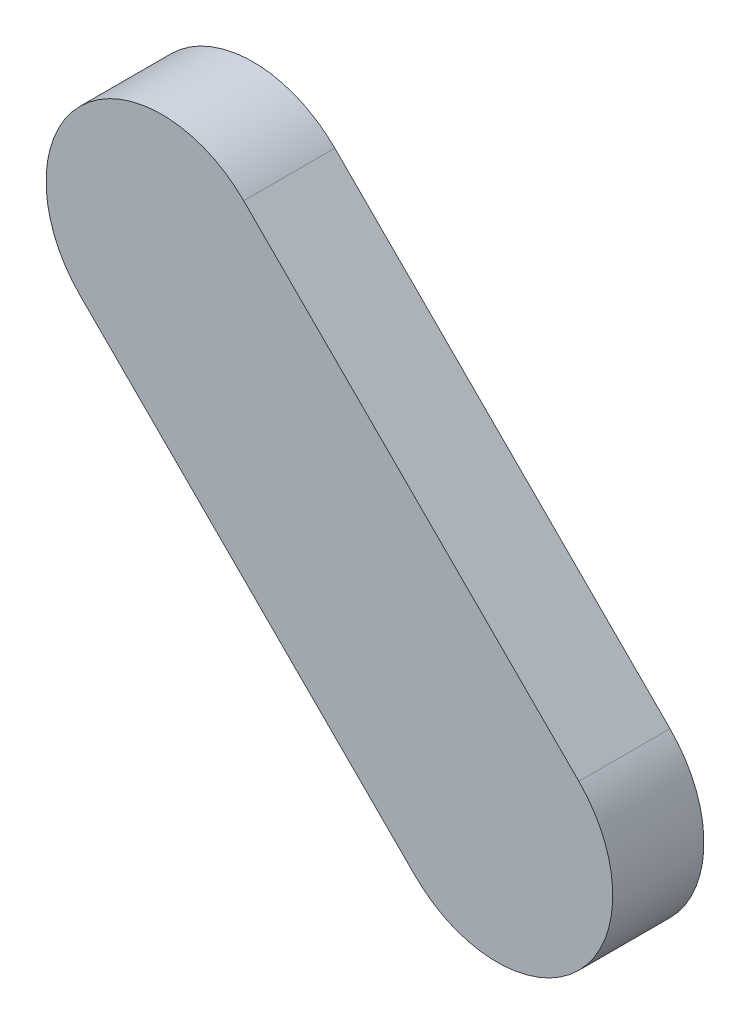
ISO-10303-21;
HEADER;
FILE_DESCRIPTION(('STEP AP214'),'2;1');
FILE_NAME('part.step','',(''),(''),'','','');
FILE_SCHEMA(('AUTOMOTIVE_DESIGN { 1 0 10303 214 1 1 1 1 }'));
ENDSEC;
DATA;
#1=APPLICATION_CONTEXT('core data for automotive mechanical design processes');
#2=APPLICATION_PROTOCOL_DEFINITION('international standard','automotive_design',2000,#1);
#3=PRODUCT_CONTEXT('',#1,'mechanical');
#4=PRODUCT('Part','Part','',(#3));
#5=PRODUCT_RELATED_PRODUCT_CATEGORY('part','',(#4));
#6=PRODUCT_DEFINITION_FORMATION('','',#4);
#7=PRODUCT_DEFINITION_CONTEXT('part definition',#1,'design');
#8=PRODUCT_DEFINITION('design','',#6,#7);
#9=PRODUCT_DEFINITION_SHAPE('','',#8);
#10=(LENGTH_UNIT() NAMED_UNIT(*) SI_UNIT(.MILLI.,.METRE.));
#11=(NAMED_UNIT(*) PLANE_ANGLE_UNIT() SI_UNIT($,.RADIAN.));
#12=(NAMED_UNIT(*) SI_UNIT($,.STERADIAN.) SOLID_ANGLE_UNIT());
#13=UNCERTAINTY_MEASURE_WITH_UNIT(LENGTH_MEASURE(1.E-05),#10,'distance_accuracy_value','');
#14=(GEOMETRIC_REPRESENTATION_CONTEXT(3) GLOBAL_UNCERTAINTY_ASSIGNED_CONTEXT((#13)) GLOBAL_UNIT_ASSIGNED_CONTEXT((#10,
#11,#12)) REPRESENTATION_CONTEXT('',''));
#15=CARTESIAN_POINT('',(0.,0.,0.));
#16=DIRECTION('',(0.,0.,1.));
#17=DIRECTION('',(1.,0.,0.));
#18=AXIS2_PLACEMENT_3D('',#15,#16,#17);
#19=CARTESIAN_POINT('',(90.83535046,67.67049966,0.));
#20=DIRECTION('',(0.707106781186548,0.707106781186548,0.));
#21=DIRECTION('',(0.707106781186548,-0.707106781186548,0.));
#22=AXIS2_PLACEMENT_3D('',#19,#20,#21);
#23=PLANE('',#22);
#24=DIRECTION('',(0.707106781186548,-0.707106781186548,0.));
#25=VECTOR('',#24,1.);
#26=CARTESIAN_POINT('',(90.83535046,67.67049966,0.1999996));
#27=LINE('',#26,#25);
#28=CARTESIAN_POINT('',(90.83535046,67.67049966,0.1999996));
#29=VERTEX_POINT('',#28);
#30=CARTESIAN_POINT('',(91.57088366,66.93496646,0.1999996));
#31=VERTEX_POINT('',#30);
#32=EDGE_CURVE('E11',#29,#31,#27,.T.);
#33=ORIENTED_EDGE('',*,*,#32,.F.);
#34=DIRECTION('',(0.,0.,1.));
#35=VECTOR('',#34,1.);
#36=CARTESIAN_POINT('',(90.83535046,67.67049966,0.));
#37=LINE('',#36,#35);
#38=CARTESIAN_POINT('',(90.83535046,67.67049966,0.));
#39=VERTEX_POINT('',#38);
#40=EDGE_CURVE('E24',#39,#29,#37,.T.);
#41=ORIENTED_EDGE('',*,*,#40,.F.);
#42=DIRECTION('',(0.707106781186548,-0.707106781186548,0.));
#43=VECTOR('',#42,1.);
#44=CARTESIAN_POINT('',(90.83535046,67.67049966,0.));
#45=LINE('',#44,#43);
#46=CARTESIAN_POINT('',(91.57088366,66.93496646,0.));
#47=VERTEX_POINT('',#46);
#48=EDGE_CURVE('E75',#39,#47,#45,.T.);
#49=ORIENTED_EDGE('',*,*,#48,.T.);
#50=DIRECTION('',(0.,0.,1.));
#51=VECTOR('',#50,1.);
#52=CARTESIAN_POINT('',(91.57088366,66.93496646,0.));
#53=LINE('',#52,#51);
#54=EDGE_CURVE('E37',#47,#31,#53,.T.);
#55=ORIENTED_EDGE('',*,*,#54,.T.);
#56=EDGE_LOOP('',(#33,#41,#49,#55));
#57=FACE_BOUND('',#56,.T.);
#58=ADVANCED_FACE('F17',(#57),#23,.F.);
#59=CARTESIAN_POINT('',(91.7504896,67.1145724,0.));
#60=DIRECTION('',(0.,0.,-1.));
#61=DIRECTION('',(-0.707106781186548,-0.707106781186548,0.));
#62=AXIS2_PLACEMENT_3D('',#59,#60,#61);
#63=CYLINDRICAL_SURFACE('',#62,0.254001156230771);
#64=CARTESIAN_POINT('',(91.7504896,67.1145724,0.1999996));
#65=DIRECTION('',(0.,0.,1.));
#66=DIRECTION('',(-0.707106781186548,-0.707106781186548,0.));
#67=AXIS2_PLACEMENT_3D('',#64,#65,#66);
#68=CIRCLE('',#67,0.254001156230771);
#69=CARTESIAN_POINT('',(91.93009554,67.29417834,0.1999996));
#70=VERTEX_POINT('',#69);
#71=EDGE_CURVE('E83',#31,#70,#68,.T.);
#72=ORIENTED_EDGE('',*,*,#71,.F.);
#73=ORIENTED_EDGE('',*,*,#54,.F.);
#74=CARTESIAN_POINT('',(91.7504896,67.1145724,0.));
#75=DIRECTION('',(0.,0.,1.));
#76=DIRECTION('',(-0.707106781186548,-0.707106781186548,0.));
#77=AXIS2_PLACEMENT_3D('',#74,#75,#76);
#78=CIRCLE('',#77,0.254001156230771);
#79=CARTESIAN_POINT('',(91.93009554,67.29417834,0.));
#80=VERTEX_POINT('',#79);
#81=EDGE_CURVE('E81',#47,#80,#78,.T.);
#82=ORIENTED_EDGE('',*,*,#81,.T.);
#83=DIRECTION('',(0.,0.,1.));
#84=VECTOR('',#83,1.);
#85=CARTESIAN_POINT('',(91.93009554,67.29417834,0.));
#86=LINE('',#85,#84);
#87=EDGE_CURVE('E67',#80,#70,#86,.T.);
#88=ORIENTED_EDGE('',*,*,#87,.T.);
#89=EDGE_LOOP('',(#72,#73,#82,#88));
#90=FACE_BOUND('',#89,.T.);
#91=ADVANCED_FACE('F89',(#90),#63,.T.);
#92=CARTESIAN_POINT('',(91.93009554,67.29417834,0.));
#93=DIRECTION('',(-0.707106781186541,-0.707106781186554,0.));
#94=DIRECTION('',(-0.707106781186554,0.707106781186541,0.));
#95=AXIS2_PLACEMENT_3D('',#92,#93,#94);
#96=PLANE('',#95);
#97=DIRECTION('',(-0.707106781186554,0.707106781186541,0.));
#98=VECTOR('',#97,1.);
#99=CARTESIAN_POINT('',(91.93009554,67.29417834,0.1999996));
#100=LINE('',#99,#98);
#101=CARTESIAN_POINT('',(91.19456234,68.02971154,0.1999996));
#102=VERTEX_POINT('',#101);
#103=EDGE_CURVE('E71',#70,#102,#100,.T.);
#104=ORIENTED_EDGE('',*,*,#103,.F.);
#105=ORIENTED_EDGE('',*,*,#87,.F.);
#106=DIRECTION('',(-0.707106781186554,0.707106781186541,0.));
#107=VECTOR('',#106,1.);
#108=CARTESIAN_POINT('',(91.93009554,67.29417834,0.));
#109=LINE('',#108,#107);
#110=CARTESIAN_POINT('',(91.19456234,68.02971154,0.));
#111=VERTEX_POINT('',#110);
#112=EDGE_CURVE('E63',#80,#111,#109,.T.);
#113=ORIENTED_EDGE('',*,*,#112,.T.);
#114=DIRECTION('',(0.,0.,1.));
#115=VECTOR('',#114,1.);
#116=CARTESIAN_POINT('',(91.19456234,68.02971154,0.));
#117=LINE('',#116,#115);
#118=EDGE_CURVE('E53',#111,#102,#117,.T.);
#119=ORIENTED_EDGE('',*,*,#118,.T.);
#120=EDGE_LOOP('',(#104,#105,#113,#119));
#121=FACE_BOUND('',#120,.T.);
#122=ADVANCED_FACE('F66',(#121),#96,.F.);
#123=CARTESIAN_POINT('',(91.0149564,67.8501056,0.));
#124=DIRECTION('',(0.,0.,-1.));
#125=DIRECTION('',(0.707106781186548,0.707106781186548,0.));
#126=AXIS2_PLACEMENT_3D('',#123,#124,#125);
#127=CYLINDRICAL_SURFACE('',#126,0.254001156230764);
#128=CARTESIAN_POINT('',(91.0149564,67.8501056,0.1999996));
#129=DIRECTION('',(0.,0.,1.));
#130=DIRECTION('',(0.707106781186548,0.707106781186548,0.));
#131=AXIS2_PLACEMENT_3D('',#128,#129,#130);
#132=CIRCLE('',#131,0.254001156230764);
#133=EDGE_CURVE('E59',#102,#29,#132,.T.);
#134=ORIENTED_EDGE('',*,*,#133,.F.);
#135=ORIENTED_EDGE('',*,*,#118,.F.);
#136=CARTESIAN_POINT('',(91.0149564,67.8501056,0.));
#137=DIRECTION('',(0.,0.,1.));
#138=DIRECTION('',(0.707106781186548,0.707106781186548,0.));
#139=AXIS2_PLACEMENT_3D('',#136,#137,#138);
#140=CIRCLE('',#139,0.254001156230764);
#141=EDGE_CURVE('E57',#111,#39,#140,.T.);
#142=ORIENTED_EDGE('',*,*,#141,.T.);
#143=ORIENTED_EDGE('',*,*,#40,.T.);
#144=EDGE_LOOP('',(#134,#135,#142,#143));
#145=FACE_BOUND('',#144,.T.);
#146=ADVANCED_FACE('F55',(#145),#127,.T.);
#147=CARTESIAN_POINT('',(90.83535046,67.67049966,0.));
#148=DIRECTION('',(0.,0.,-1.));
#149=DIRECTION('',(-1.,0.,0.));
#150=AXIS2_PLACEMENT_3D('',#147,#148,#149);
#151=PLANE('',#150);
#152=ORIENTED_EDGE('',*,*,#141,.F.);
#153=ORIENTED_EDGE('',*,*,#112,.F.);
#154=ORIENTED_EDGE('',*,*,#81,.F.);
#155=ORIENTED_EDGE('',*,*,#48,.F.);
#156=EDGE_LOOP('',(#152,#153,#154,#155));
#157=FACE_BOUND('',#156,.T.);
#158=ADVANCED_FACE('F74',(#157),#151,.T.);
#159=CARTESIAN_POINT('',(90.83535046,67.67049966,0.1999996));
#160=DIRECTION('',(0.,0.,-1.));
#161=DIRECTION('',(-1.,0.,0.));
#162=AXIS2_PLACEMENT_3D('',#159,#160,#161);
#163=PLANE('',#162);
#164=ORIENTED_EDGE('',*,*,#32,.T.);
#165=ORIENTED_EDGE('',*,*,#71,.T.);
#166=ORIENTED_EDGE('',*,*,#103,.T.);
#167=ORIENTED_EDGE('',*,*,#133,.T.);
#168=EDGE_LOOP('',(#164,#165,#166,#167));
#169=FACE_BOUND('',#168,.T.);
#170=ADVANCED_FACE('F91',(#169),#163,.F.);
#171=CLOSED_SHELL('',(#58,#91,#122,#146,#158,#170));
#172=MANIFOLD_SOLID_BREP('B1',#171);
#173=ADVANCED_BREP_SHAPE_REPRESENTATION('',(#18,#172),#14);
#174=SHAPE_DEFINITION_REPRESENTATION(#9,#173);
ENDSEC;
END-ISO-10303-21;
